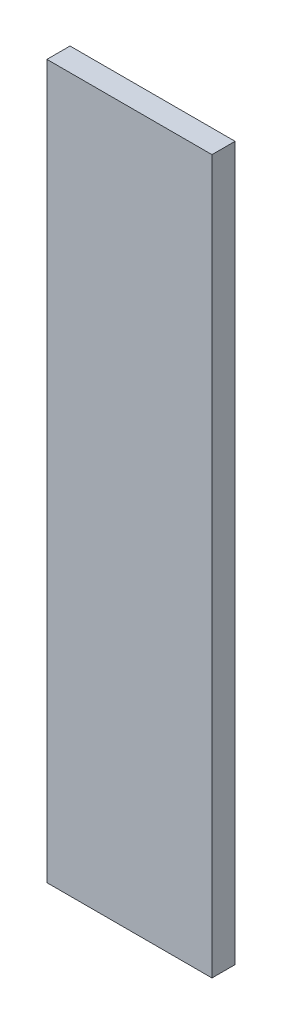
ISO-10303-21;
HEADER;
FILE_DESCRIPTION(('STEP AP214'),'2;1');
FILE_NAME('part.step','',(''),(''),'','','');
FILE_SCHEMA(('AUTOMOTIVE_DESIGN { 1 0 10303 214 1 1 1 1 }'));
ENDSEC;
DATA;
#1=APPLICATION_CONTEXT('core data for automotive mechanical design processes');
#2=APPLICATION_PROTOCOL_DEFINITION('international standard','automotive_design',2000,#1);
#3=PRODUCT_CONTEXT('',#1,'mechanical');
#4=PRODUCT('Part','Part','',(#3));
#5=PRODUCT_RELATED_PRODUCT_CATEGORY('part','',(#4));
#6=PRODUCT_DEFINITION_FORMATION('','',#4);
#7=PRODUCT_DEFINITION_CONTEXT('part definition',#1,'design');
#8=PRODUCT_DEFINITION('design','',#6,#7);
#9=PRODUCT_DEFINITION_SHAPE('','',#8);
#10=(LENGTH_UNIT() NAMED_UNIT(*) SI_UNIT(.MILLI.,.METRE.));
#11=(NAMED_UNIT(*) PLANE_ANGLE_UNIT() SI_UNIT($,.RADIAN.));
#12=(NAMED_UNIT(*) SI_UNIT($,.STERADIAN.) SOLID_ANGLE_UNIT());
#13=UNCERTAINTY_MEASURE_WITH_UNIT(LENGTH_MEASURE(1.E-05),#10,'distance_accuracy_value','');
#14=(GEOMETRIC_REPRESENTATION_CONTEXT(3) GLOBAL_UNCERTAINTY_ASSIGNED_CONTEXT((#13)) GLOBAL_UNIT_ASSIGNED_CONTEXT((#10,
#11,#12)) REPRESENTATION_CONTEXT('',''));
#15=CARTESIAN_POINT('',(0.,0.,0.));
#16=DIRECTION('',(0.,0.,1.));
#17=DIRECTION('',(1.,0.,0.));
#18=AXIS2_PLACEMENT_3D('',#15,#16,#17);
#19=CARTESIAN_POINT('',(1950.,550.,35.));
#20=DIRECTION('',(0.,1.,0.));
#21=DIRECTION('',(0.,0.,1.));
#22=AXIS2_PLACEMENT_3D('',#19,#20,#21);
#23=PLANE('',#22);
#24=DIRECTION('',(1.,0.,0.));
#25=VECTOR('',#24,1.);
#26=CARTESIAN_POINT('',(1950.,550.,0.));
#27=LINE('',#26,#25);
#28=CARTESIAN_POINT('',(1700.,550.,0.));
#29=VERTEX_POINT('',#28);
#30=CARTESIAN_POINT('',(1950.,550.,0.));
#31=VERTEX_POINT('',#30);
#32=EDGE_CURVE('E105',#29,#31,#27,.T.);
#33=ORIENTED_EDGE('',*,*,#32,.T.);
#34=DIRECTION('',(0.,0.,-1.));
#35=VECTOR('',#34,1.);
#36=CARTESIAN_POINT('',(1950.,550.,35.));
#37=LINE('',#36,#35);
#38=CARTESIAN_POINT('',(1950.,550.,35.));
#39=VERTEX_POINT('',#38);
#40=EDGE_CURVE('E11',#39,#31,#37,.T.);
#41=ORIENTED_EDGE('',*,*,#40,.F.);
#42=DIRECTION('',(1.,0.,0.));
#43=VECTOR('',#42,1.);
#44=CARTESIAN_POINT('',(1950.,550.,35.));
#45=LINE('',#44,#43);
#46=CARTESIAN_POINT('',(1700.,550.,35.));
#47=VERTEX_POINT('',#46);
#48=EDGE_CURVE('E89',#47,#39,#45,.T.);
#49=ORIENTED_EDGE('',*,*,#48,.F.);
#50=DIRECTION('',(0.,0.,-1.));
#51=VECTOR('',#50,1.);
#52=CARTESIAN_POINT('',(1700.,550.,35.));
#53=LINE('',#52,#51);
#54=EDGE_CURVE('E97',#47,#29,#53,.T.);
#55=ORIENTED_EDGE('',*,*,#54,.T.);
#56=EDGE_LOOP('',(#33,#41,#49,#55));
#57=FACE_BOUND('',#56,.T.);
#58=ADVANCED_FACE('F39',(#57),#23,.F.);
#59=CARTESIAN_POINT('',(1950.,1630.,35.));
#60=DIRECTION('',(-1.,0.,0.));
#61=DIRECTION('',(0.,0.,1.));
#62=AXIS2_PLACEMENT_3D('',#59,#60,#61);
#63=PLANE('',#62);
#64=DIRECTION('',(0.,1.,0.));
#65=VECTOR('',#64,1.);
#66=CARTESIAN_POINT('',(1950.,1630.,0.));
#67=LINE('',#66,#65);
#68=CARTESIAN_POINT('',(1950.,1630.,0.));
#69=VERTEX_POINT('',#68);
#70=EDGE_CURVE('E92',#31,#69,#67,.T.);
#71=ORIENTED_EDGE('',*,*,#70,.T.);
#72=DIRECTION('',(0.,0.,-1.));
#73=VECTOR('',#72,1.);
#74=CARTESIAN_POINT('',(1950.,1630.,35.));
#75=LINE('',#74,#73);
#76=CARTESIAN_POINT('',(1950.,1630.,35.));
#77=VERTEX_POINT('',#76);
#78=EDGE_CURVE('E50',#77,#69,#75,.T.);
#79=ORIENTED_EDGE('',*,*,#78,.F.);
#80=DIRECTION('',(0.,1.,0.));
#81=VECTOR('',#80,1.);
#82=CARTESIAN_POINT('',(1950.,1630.,35.));
#83=LINE('',#82,#81);
#84=EDGE_CURVE('E82',#39,#77,#83,.T.);
#85=ORIENTED_EDGE('',*,*,#84,.F.);
#86=ORIENTED_EDGE('',*,*,#40,.T.);
#87=EDGE_LOOP('',(#71,#79,#85,#86));
#88=FACE_BOUND('',#87,.T.);
#89=ADVANCED_FACE('F93',(#88),#63,.F.);
#90=CARTESIAN_POINT('',(1700.,1630.,35.));
#91=DIRECTION('',(0.,-1.,0.));
#92=DIRECTION('',(0.,0.,-1.));
#93=AXIS2_PLACEMENT_3D('',#90,#91,#92);
#94=PLANE('',#93);
#95=DIRECTION('',(-1.,0.,0.));
#96=VECTOR('',#95,1.);
#97=CARTESIAN_POINT('',(1700.,1630.,0.));
#98=LINE('',#97,#96);
#99=CARTESIAN_POINT('',(1700.,1630.,0.));
#100=VERTEX_POINT('',#99);
#101=EDGE_CURVE('E72',#69,#100,#98,.T.);
#102=ORIENTED_EDGE('',*,*,#101,.T.);
#103=DIRECTION('',(0.,0.,-1.));
#104=VECTOR('',#103,1.);
#105=CARTESIAN_POINT('',(1700.,1630.,35.));
#106=LINE('',#105,#104);
#107=CARTESIAN_POINT('',(1700.,1630.,35.));
#108=VERTEX_POINT('',#107);
#109=EDGE_CURVE('E94',#108,#100,#106,.T.);
#110=ORIENTED_EDGE('',*,*,#109,.F.);
#111=DIRECTION('',(-1.,0.,0.));
#112=VECTOR('',#111,1.);
#113=CARTESIAN_POINT('',(1700.,1630.,35.));
#114=LINE('',#113,#112);
#115=EDGE_CURVE('E88',#77,#108,#114,.T.);
#116=ORIENTED_EDGE('',*,*,#115,.F.);
#117=ORIENTED_EDGE('',*,*,#78,.T.);
#118=EDGE_LOOP('',(#102,#110,#116,#117));
#119=FACE_BOUND('',#118,.T.);
#120=ADVANCED_FACE('F96',(#119),#94,.F.);
#121=CARTESIAN_POINT('',(1700.,550.,35.));
#122=DIRECTION('',(1.,0.,0.));
#123=DIRECTION('',(0.,0.,-1.));
#124=AXIS2_PLACEMENT_3D('',#121,#122,#123);
#125=PLANE('',#124);
#126=DIRECTION('',(0.,-1.,0.));
#127=VECTOR('',#126,1.);
#128=CARTESIAN_POINT('',(1700.,550.,0.));
#129=LINE('',#128,#127);
#130=EDGE_CURVE('E76',#100,#29,#129,.T.);
#131=ORIENTED_EDGE('',*,*,#130,.T.);
#132=ORIENTED_EDGE('',*,*,#54,.F.);
#133=DIRECTION('',(0.,-1.,0.));
#134=VECTOR('',#133,1.);
#135=CARTESIAN_POINT('',(1700.,550.,35.));
#136=LINE('',#135,#134);
#137=EDGE_CURVE('E54',#108,#47,#136,.T.);
#138=ORIENTED_EDGE('',*,*,#137,.F.);
#139=ORIENTED_EDGE('',*,*,#109,.T.);
#140=EDGE_LOOP('',(#131,#132,#138,#139));
#141=FACE_BOUND('',#140,.T.);
#142=ADVANCED_FACE('F108',(#141),#125,.F.);
#143=CARTESIAN_POINT('',(0.,0.,35.));
#144=DIRECTION('',(0.,0.,-1.));
#145=DIRECTION('',(-1.,0.,0.));
#146=AXIS2_PLACEMENT_3D('',#143,#144,#145);
#147=PLANE('',#146);
#148=ORIENTED_EDGE('',*,*,#48,.T.);
#149=ORIENTED_EDGE('',*,*,#84,.T.);
#150=ORIENTED_EDGE('',*,*,#115,.T.);
#151=ORIENTED_EDGE('',*,*,#137,.T.);
#152=EDGE_LOOP('',(#148,#149,#150,#151));
#153=FACE_BOUND('',#152,.T.);
#154=ADVANCED_FACE('F86',(#153),#147,.F.);
#155=CARTESIAN_POINT('',(0.,0.,0.));
#156=DIRECTION('',(0.,0.,-1.));
#157=DIRECTION('',(-1.,0.,0.));
#158=AXIS2_PLACEMENT_3D('',#155,#156,#157);
#159=PLANE('',#158);
#160=ORIENTED_EDGE('',*,*,#32,.F.);
#161=ORIENTED_EDGE('',*,*,#130,.F.);
#162=ORIENTED_EDGE('',*,*,#101,.F.);
#163=ORIENTED_EDGE('',*,*,#70,.F.);
#164=EDGE_LOOP('',(#160,#161,#162,#163));
#165=FACE_BOUND('',#164,.T.);
#166=ADVANCED_FACE('F115',(#165),#159,.T.);
#167=CLOSED_SHELL('',(#58,#89,#120,#142,#154,#166));
#168=MANIFOLD_SOLID_BREP('B2',#167);
#169=ADVANCED_BREP_SHAPE_REPRESENTATION('',(#18,#168),#14);
#170=SHAPE_DEFINITION_REPRESENTATION(#9,#169);
ENDSEC;
END-ISO-10303-21;
